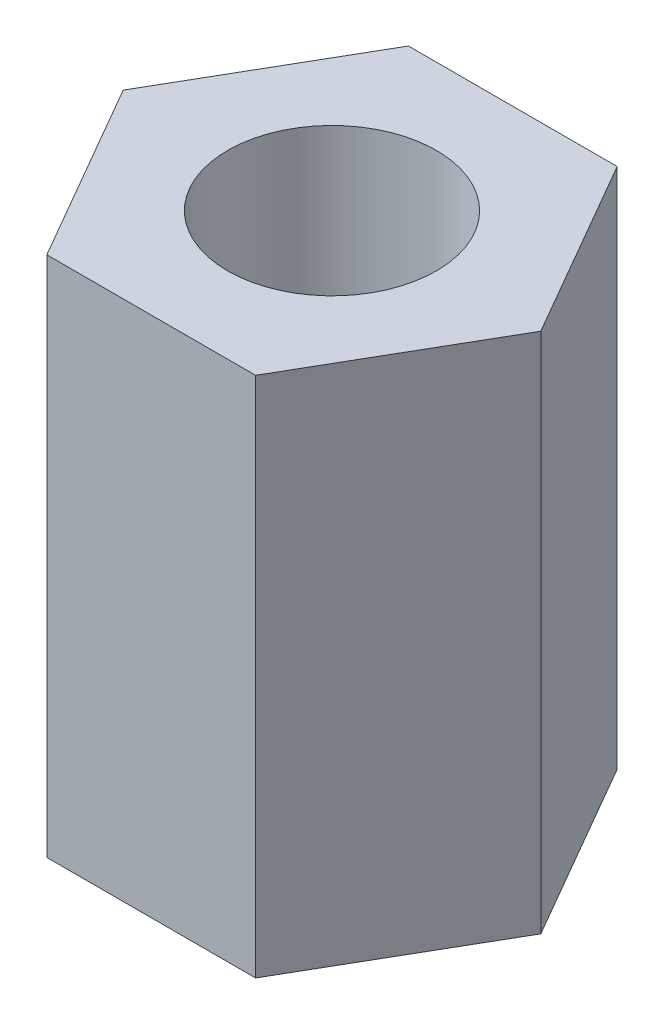
ISO-10303-21;
HEADER;
FILE_DESCRIPTION(('STEP AP214'),'2;1');
FILE_NAME('part.step','',(''),(''),'','','');
FILE_SCHEMA(('AUTOMOTIVE_DESIGN { 1 0 10303 214 1 1 1 1 }'));
ENDSEC;
DATA;
#1=APPLICATION_CONTEXT('core data for automotive mechanical design processes');
#2=APPLICATION_PROTOCOL_DEFINITION('international standard','automotive_design',2000,#1);
#3=PRODUCT_CONTEXT('',#1,'mechanical');
#4=PRODUCT('Part','Part','',(#3));
#5=PRODUCT_RELATED_PRODUCT_CATEGORY('part','',(#4));
#6=PRODUCT_DEFINITION_FORMATION('','',#4);
#7=PRODUCT_DEFINITION_CONTEXT('part definition',#1,'design');
#8=PRODUCT_DEFINITION('design','',#6,#7);
#9=PRODUCT_DEFINITION_SHAPE('','',#8);
#10=(LENGTH_UNIT() NAMED_UNIT(*) SI_UNIT(.MILLI.,.METRE.));
#11=(NAMED_UNIT(*) PLANE_ANGLE_UNIT() SI_UNIT($,.RADIAN.));
#12=(NAMED_UNIT(*) SI_UNIT($,.STERADIAN.) SOLID_ANGLE_UNIT());
#13=UNCERTAINTY_MEASURE_WITH_UNIT(LENGTH_MEASURE(1.E-05),#10,'distance_accuracy_value','');
#14=(GEOMETRIC_REPRESENTATION_CONTEXT(3) GLOBAL_UNCERTAINTY_ASSIGNED_CONTEXT((#13)) GLOBAL_UNIT_ASSIGNED_CONTEXT((#10,
#11,#12)) REPRESENTATION_CONTEXT('',''));
#15=CARTESIAN_POINT('',(0.,0.,0.));
#16=DIRECTION('',(0.,0.,1.));
#17=DIRECTION('',(1.,0.,0.));
#18=AXIS2_PLACEMENT_3D('',#15,#16,#17);
#19=CARTESIAN_POINT('',(0.,15.,0.));
#20=DIRECTION('',(0.,1.,0.));
#21=DIRECTION('',(0.,0.,1.));
#22=AXIS2_PLACEMENT_3D('',#19,#20,#21);
#23=PLANE('',#22);
#24=DIRECTION('',(-0.5,0.,0.866025403784439));
#25=VECTOR('',#24,1.);
#26=CARTESIAN_POINT('',(-3.,15.,-5.19615242270663));
#27=LINE('',#26,#25);
#28=CARTESIAN_POINT('',(-3.,15.,-5.19615242270663));
#29=VERTEX_POINT('',#28);
#30=CARTESIAN_POINT('',(-6.,15.,0.));
#31=VERTEX_POINT('',#30);
#32=EDGE_CURVE('E143',#29,#31,#27,.T.);
#33=ORIENTED_EDGE('',*,*,#32,.T.);
#34=DIRECTION('',(0.5,0.,0.866025403784439));
#35=VECTOR('',#34,1.);
#36=CARTESIAN_POINT('',(-6.,15.,0.));
#37=LINE('',#36,#35);
#38=CARTESIAN_POINT('',(-3.,15.,5.19615242270663));
#39=VERTEX_POINT('',#38);
#40=EDGE_CURVE('E97',#31,#39,#37,.T.);
#41=ORIENTED_EDGE('',*,*,#40,.T.);
#42=DIRECTION('',(1.,0.,0.));
#43=VECTOR('',#42,1.);
#44=CARTESIAN_POINT('',(-3.,15.,5.19615242270663));
#45=LINE('',#44,#43);
#46=CARTESIAN_POINT('',(3.,15.,5.19615242270663));
#47=VERTEX_POINT('',#46);
#48=EDGE_CURVE('E115',#39,#47,#45,.T.);
#49=ORIENTED_EDGE('',*,*,#48,.T.);
#50=DIRECTION('',(0.5,0.,-0.866025403784439));
#51=VECTOR('',#50,1.);
#52=CARTESIAN_POINT('',(3.,15.,5.19615242270663));
#53=LINE('',#52,#51);
#54=CARTESIAN_POINT('',(6.,15.,0.));
#55=VERTEX_POINT('',#54);
#56=EDGE_CURVE('E106',#47,#55,#53,.T.);
#57=ORIENTED_EDGE('',*,*,#56,.T.);
#58=DIRECTION('',(-0.5,0.,-0.866025403784439));
#59=VECTOR('',#58,1.);
#60=CARTESIAN_POINT('',(6.,15.,0.));
#61=LINE('',#60,#59);
#62=CARTESIAN_POINT('',(3.,15.,-5.19615242270663));
#63=VERTEX_POINT('',#62);
#64=EDGE_CURVE('E109',#55,#63,#61,.T.);
#65=ORIENTED_EDGE('',*,*,#64,.T.);
#66=DIRECTION('',(-1.,0.,0.));
#67=VECTOR('',#66,1.);
#68=CARTESIAN_POINT('',(3.,15.,-5.19615242270663));
#69=LINE('',#68,#67);
#70=EDGE_CURVE('E64',#63,#29,#69,.T.);
#71=ORIENTED_EDGE('',*,*,#70,.T.);
#72=EDGE_LOOP('',(#33,#41,#49,#57,#65,#71));
#73=FACE_BOUND('',#72,.T.);
#74=CARTESIAN_POINT('',(0.,15.,0.));
#75=DIRECTION('',(0.,1.,0.));
#76=DIRECTION('',(0.,0.,1.));
#77=AXIS2_PLACEMENT_3D('',#74,#75,#76);
#78=CIRCLE('',#77,3.);
#79=CARTESIAN_POINT('',(0.,15.,3.));
#80=VERTEX_POINT('',#79);
#81=EDGE_CURVE('E135',#80,#80,#78,.T.);
#82=ORIENTED_EDGE('',*,*,#81,.F.);
#83=EDGE_LOOP('',(#82));
#84=FACE_BOUND('',#83,.T.);
#85=ADVANCED_FACE('F44',(#73,#84),#23,.T.);
#86=CARTESIAN_POINT('',(0.,0.,0.));
#87=DIRECTION('',(0.,1.,0.));
#88=DIRECTION('',(0.,0.,1.));
#89=AXIS2_PLACEMENT_3D('',#86,#87,#88);
#90=PLANE('',#89);
#91=DIRECTION('',(-0.5,0.,0.866025403784439));
#92=VECTOR('',#91,1.);
#93=CARTESIAN_POINT('',(-3.,0.,-5.19615242270663));
#94=LINE('',#93,#92);
#95=CARTESIAN_POINT('',(-3.,0.,-5.19615242270663));
#96=VERTEX_POINT('',#95);
#97=CARTESIAN_POINT('',(-6.,0.,0.));
#98=VERTEX_POINT('',#97);
#99=EDGE_CURVE('E128',#96,#98,#94,.T.);
#100=ORIENTED_EDGE('',*,*,#99,.F.);
#101=DIRECTION('',(-1.,0.,0.));
#102=VECTOR('',#101,1.);
#103=CARTESIAN_POINT('',(3.,0.,-5.19615242270663));
#104=LINE('',#103,#102);
#105=CARTESIAN_POINT('',(3.,0.,-5.19615242270663));
#106=VERTEX_POINT('',#105);
#107=EDGE_CURVE('E93',#106,#96,#104,.T.);
#108=ORIENTED_EDGE('',*,*,#107,.F.);
#109=DIRECTION('',(-0.5,0.,-0.866025403784439));
#110=VECTOR('',#109,1.);
#111=CARTESIAN_POINT('',(6.,0.,0.));
#112=LINE('',#111,#110);
#113=CARTESIAN_POINT('',(6.,0.,0.));
#114=VERTEX_POINT('',#113);
#115=EDGE_CURVE('E82',#114,#106,#112,.T.);
#116=ORIENTED_EDGE('',*,*,#115,.F.);
#117=DIRECTION('',(0.5,0.,-0.866025403784439));
#118=VECTOR('',#117,1.);
#119=CARTESIAN_POINT('',(3.,0.,5.19615242270663));
#120=LINE('',#119,#118);
#121=CARTESIAN_POINT('',(3.,0.,5.19615242270663));
#122=VERTEX_POINT('',#121);
#123=EDGE_CURVE('E116',#122,#114,#120,.T.);
#124=ORIENTED_EDGE('',*,*,#123,.F.);
#125=DIRECTION('',(1.,0.,0.));
#126=VECTOR('',#125,1.);
#127=CARTESIAN_POINT('',(-3.,0.,5.19615242270663));
#128=LINE('',#127,#126);
#129=CARTESIAN_POINT('',(-3.,0.,5.19615242270663));
#130=VERTEX_POINT('',#129);
#131=EDGE_CURVE('E139',#130,#122,#128,.T.);
#132=ORIENTED_EDGE('',*,*,#131,.F.);
#133=DIRECTION('',(0.5,0.,0.866025403784439));
#134=VECTOR('',#133,1.);
#135=CARTESIAN_POINT('',(-6.,0.,0.));
#136=LINE('',#135,#134);
#137=EDGE_CURVE('E132',#98,#130,#136,.T.);
#138=ORIENTED_EDGE('',*,*,#137,.F.);
#139=EDGE_LOOP('',(#100,#108,#116,#124,#132,#138));
#140=FACE_BOUND('',#139,.T.);
#141=CARTESIAN_POINT('',(0.,0.,0.));
#142=DIRECTION('',(0.,1.,0.));
#143=DIRECTION('',(0.,0.,1.));
#144=AXIS2_PLACEMENT_3D('',#141,#142,#143);
#145=CIRCLE('',#144,3.);
#146=CARTESIAN_POINT('',(0.,0.,3.));
#147=VERTEX_POINT('',#146);
#148=EDGE_CURVE('E269',#147,#147,#145,.T.);
#149=ORIENTED_EDGE('',*,*,#148,.T.);
#150=EDGE_LOOP('',(#149));
#151=FACE_BOUND('',#150,.T.);
#152=ADVANCED_FACE('F147',(#140,#151),#90,.F.);
#153=CARTESIAN_POINT('',(-3.,15.,-5.19615242270663));
#154=DIRECTION('',(0.866025403784439,0.,0.5));
#155=DIRECTION('',(0.5,0.,-0.866025403784439));
#156=AXIS2_PLACEMENT_3D('',#153,#154,#155);
#157=PLANE('',#156);
#158=ORIENTED_EDGE('',*,*,#99,.T.);
#159=DIRECTION('',(0.,-1.,0.));
#160=VECTOR('',#159,1.);
#161=CARTESIAN_POINT('',(-6.,15.,0.));
#162=LINE('',#161,#160);
#163=EDGE_CURVE('E11',#31,#98,#162,.T.);
#164=ORIENTED_EDGE('',*,*,#163,.F.);
#165=ORIENTED_EDGE('',*,*,#32,.F.);
#166=DIRECTION('',(0.,-1.,0.));
#167=VECTOR('',#166,1.);
#168=CARTESIAN_POINT('',(-3.,15.,-5.19615242270663));
#169=LINE('',#168,#167);
#170=EDGE_CURVE('E127',#29,#96,#169,.T.);
#171=ORIENTED_EDGE('',*,*,#170,.T.);
#172=EDGE_LOOP('',(#158,#164,#165,#171));
#173=FACE_BOUND('',#172,.T.);
#174=ADVANCED_FACE('F50',(#173),#157,.F.);
#175=CARTESIAN_POINT('',(-6.,15.,0.));
#176=DIRECTION('',(0.866025403784439,0.,-0.5));
#177=DIRECTION('',(-0.5,0.,-0.866025403784439));
#178=AXIS2_PLACEMENT_3D('',#175,#176,#177);
#179=PLANE('',#178);
#180=ORIENTED_EDGE('',*,*,#137,.T.);
#181=DIRECTION('',(0.,-1.,0.));
#182=VECTOR('',#181,1.);
#183=CARTESIAN_POINT('',(-3.,15.,5.19615242270663));
#184=LINE('',#183,#182);
#185=EDGE_CURVE('E53',#39,#130,#184,.T.);
#186=ORIENTED_EDGE('',*,*,#185,.F.);
#187=ORIENTED_EDGE('',*,*,#40,.F.);
#188=ORIENTED_EDGE('',*,*,#163,.T.);
#189=EDGE_LOOP('',(#180,#186,#187,#188));
#190=FACE_BOUND('',#189,.T.);
#191=ADVANCED_FACE('F171',(#190),#179,.F.);
#192=CARTESIAN_POINT('',(-3.,15.,5.19615242270663));
#193=DIRECTION('',(0.,0.,-1.));
#194=DIRECTION('',(-1.,0.,0.));
#195=AXIS2_PLACEMENT_3D('',#192,#193,#194);
#196=PLANE('',#195);
#197=ORIENTED_EDGE('',*,*,#131,.T.);
#198=DIRECTION('',(0.,-1.,0.));
#199=VECTOR('',#198,1.);
#200=CARTESIAN_POINT('',(3.,15.,5.19615242270663));
#201=LINE('',#200,#199);
#202=EDGE_CURVE('E124',#47,#122,#201,.T.);
#203=ORIENTED_EDGE('',*,*,#202,.F.);
#204=ORIENTED_EDGE('',*,*,#48,.F.);
#205=ORIENTED_EDGE('',*,*,#185,.T.);
#206=EDGE_LOOP('',(#197,#203,#204,#205));
#207=FACE_BOUND('',#206,.T.);
#208=ADVANCED_FACE('F150',(#207),#196,.F.);
#209=CARTESIAN_POINT('',(3.,15.,5.19615242270663));
#210=DIRECTION('',(-0.866025403784439,0.,-0.5));
#211=DIRECTION('',(-0.5,0.,0.866025403784439));
#212=AXIS2_PLACEMENT_3D('',#209,#210,#211);
#213=PLANE('',#212);
#214=ORIENTED_EDGE('',*,*,#123,.T.);
#215=DIRECTION('',(0.,-1.,0.));
#216=VECTOR('',#215,1.);
#217=CARTESIAN_POINT('',(6.,15.,0.));
#218=LINE('',#217,#216);
#219=EDGE_CURVE('E119',#55,#114,#218,.T.);
#220=ORIENTED_EDGE('',*,*,#219,.F.);
#221=ORIENTED_EDGE('',*,*,#56,.F.);
#222=ORIENTED_EDGE('',*,*,#202,.T.);
#223=EDGE_LOOP('',(#214,#220,#221,#222));
#224=FACE_BOUND('',#223,.T.);
#225=ADVANCED_FACE('F117',(#224),#213,.F.);
#226=CARTESIAN_POINT('',(6.,15.,0.));
#227=DIRECTION('',(-0.866025403784439,0.,0.5));
#228=DIRECTION('',(0.5,0.,0.866025403784439));
#229=AXIS2_PLACEMENT_3D('',#226,#227,#228);
#230=PLANE('',#229);
#231=ORIENTED_EDGE('',*,*,#115,.T.);
#232=DIRECTION('',(0.,-1.,0.));
#233=VECTOR('',#232,1.);
#234=CARTESIAN_POINT('',(3.,15.,-5.19615242270663));
#235=LINE('',#234,#233);
#236=EDGE_CURVE('E121',#63,#106,#235,.T.);
#237=ORIENTED_EDGE('',*,*,#236,.F.);
#238=ORIENTED_EDGE('',*,*,#64,.F.);
#239=ORIENTED_EDGE('',*,*,#219,.T.);
#240=EDGE_LOOP('',(#231,#237,#238,#239));
#241=FACE_BOUND('',#240,.T.);
#242=ADVANCED_FACE('F123',(#241),#230,.F.);
#243=CARTESIAN_POINT('',(3.,15.,-5.19615242270663));
#244=DIRECTION('',(0.,0.,1.));
#245=DIRECTION('',(1.,0.,0.));
#246=AXIS2_PLACEMENT_3D('',#243,#244,#245);
#247=PLANE('',#246);
#248=ORIENTED_EDGE('',*,*,#107,.T.);
#249=ORIENTED_EDGE('',*,*,#170,.F.);
#250=ORIENTED_EDGE('',*,*,#70,.F.);
#251=ORIENTED_EDGE('',*,*,#236,.T.);
#252=EDGE_LOOP('',(#248,#249,#250,#251));
#253=FACE_BOUND('',#252,.T.);
#254=ADVANCED_FACE('F154',(#253),#247,.F.);
#255=CARTESIAN_POINT('',(0.,15.,0.));
#256=DIRECTION('',(0.,-1.,0.));
#257=DIRECTION('',(0.,0.,-1.));
#258=AXIS2_PLACEMENT_3D('',#255,#256,#257);
#259=CYLINDRICAL_SURFACE('',#258,3.);
#260=ORIENTED_EDGE('',*,*,#81,.T.);
#261=EDGE_LOOP('',(#260));
#262=FACE_BOUND('',#261,.T.);
#263=ORIENTED_EDGE('',*,*,#148,.F.);
#264=EDGE_LOOP('',(#263));
#265=FACE_BOUND('',#264,.T.);
#266=ADVANCED_FACE('F160',(#262,#265),#259,.F.);
#267=CLOSED_SHELL('',(#85,#152,#174,#191,#208,#225,#242,#254,#266));
#268=MANIFOLD_SOLID_BREP('B2',#267);
#269=ADVANCED_BREP_SHAPE_REPRESENTATION('',(#18,#268),#14);
#270=SHAPE_DEFINITION_REPRESENTATION(#9,#269);
ENDSEC;
END-ISO-10303-21;
